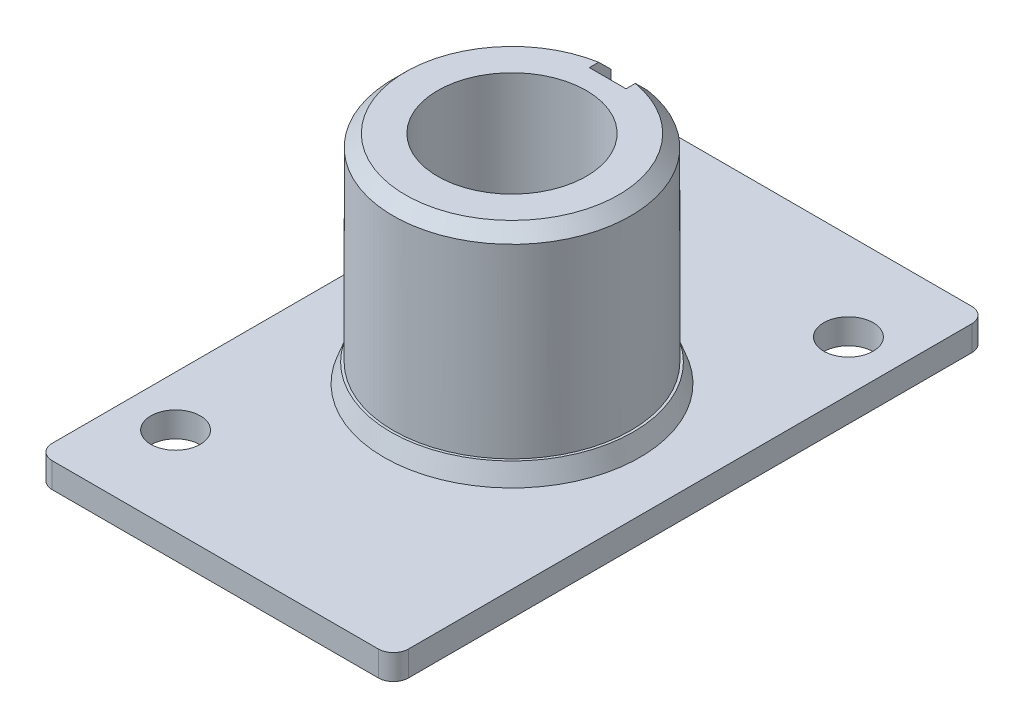
ISO-10303-21;
HEADER;
FILE_DESCRIPTION(('STEP AP214'),'2;1');
FILE_NAME('part.step','',(''),(''),'','','');
FILE_SCHEMA(('AUTOMOTIVE_DESIGN { 1 0 10303 214 1 1 1 1 }'));
ENDSEC;
DATA;
#1=APPLICATION_CONTEXT('core data for automotive mechanical design processes');
#2=APPLICATION_PROTOCOL_DEFINITION('international standard','automotive_design',2000,#1);
#3=PRODUCT_CONTEXT('',#1,'mechanical');
#4=PRODUCT('Part','Part','',(#3));
#5=PRODUCT_RELATED_PRODUCT_CATEGORY('part','',(#4));
#6=PRODUCT_DEFINITION_FORMATION('','',#4);
#7=PRODUCT_DEFINITION_CONTEXT('part definition',#1,'design');
#8=PRODUCT_DEFINITION('design','',#6,#7);
#9=PRODUCT_DEFINITION_SHAPE('','',#8);
#10=(LENGTH_UNIT() NAMED_UNIT(*) SI_UNIT(.MILLI.,.METRE.));
#11=(NAMED_UNIT(*) PLANE_ANGLE_UNIT() SI_UNIT($,.RADIAN.));
#12=(NAMED_UNIT(*) SI_UNIT($,.STERADIAN.) SOLID_ANGLE_UNIT());
#13=UNCERTAINTY_MEASURE_WITH_UNIT(LENGTH_MEASURE(1.E-05),#10,'distance_accuracy_value','');
#14=(GEOMETRIC_REPRESENTATION_CONTEXT(3) GLOBAL_UNCERTAINTY_ASSIGNED_CONTEXT((#13)) GLOBAL_UNIT_ASSIGNED_CONTEXT((#10,
#11,#12)) REPRESENTATION_CONTEXT('',''));
#15=CARTESIAN_POINT('',(0.,0.,0.));
#16=DIRECTION('',(0.,0.,1.));
#17=DIRECTION('',(1.,0.,0.));
#18=AXIS2_PLACEMENT_3D('',#15,#16,#17);
#19=CARTESIAN_POINT('',(-9.0043,0.,14.9987));
#20=DIRECTION('',(0.,-1.,0.));
#21=DIRECTION('',(0.,0.,-1.));
#22=AXIS2_PLACEMENT_3D('',#19,#20,#21);
#23=PLANE('',#22);
#24=CARTESIAN_POINT('',(6.4643,0.,-10.541));
#25=DIRECTION('',(0.,-1.,0.));
#26=DIRECTION('',(0.,0.,-1.));
#27=AXIS2_PLACEMENT_3D('',#24,#25,#26);
#28=CIRCLE('',#27,1.25);
#29=CARTESIAN_POINT('',(6.4643,0.,-11.791));
#30=VERTEX_POINT('',#29);
#31=EDGE_CURVE('E316',#30,#30,#28,.T.);
#32=ORIENTED_EDGE('',*,*,#31,.F.);
#33=EDGE_LOOP('',(#32));
#34=FACE_BOUND('',#33,.T.);
#35=CARTESIAN_POINT('',(-6.4643,0.,10.541));
#36=DIRECTION('',(0.,-1.,0.));
#37=DIRECTION('',(0.,0.,-1.));
#38=AXIS2_PLACEMENT_3D('',#35,#36,#37);
#39=CIRCLE('',#38,1.25);
#40=CARTESIAN_POINT('',(-6.4643,0.,9.291));
#41=VERTEX_POINT('',#40);
#42=EDGE_CURVE('E306',#41,#41,#39,.T.);
#43=ORIENTED_EDGE('',*,*,#42,.F.);
#44=EDGE_LOOP('',(#43));
#45=FACE_BOUND('',#44,.T.);
#46=DIRECTION('',(1.,0.,0.));
#47=VECTOR('',#46,1.);
#48=CARTESIAN_POINT('',(0.,0.,14.9987));
#49=LINE('',#48,#47);
#50=CARTESIAN_POINT('',(-8.2423,0.,14.9987));
#51=VERTEX_POINT('',#50);
#52=CARTESIAN_POINT('',(8.2423,0.,14.9987));
#53=VERTEX_POINT('',#52);
#54=EDGE_CURVE('E105',#51,#53,#49,.T.);
#55=ORIENTED_EDGE('',*,*,#54,.F.);
#56=CARTESIAN_POINT('',(-8.2423,0.,14.2367));
#57=DIRECTION('',(0.,-1.,0.));
#58=DIRECTION('',(0.,0.,-1.));
#59=AXIS2_PLACEMENT_3D('',#56,#57,#58);
#60=CIRCLE('',#59,0.762000000000006);
#61=CARTESIAN_POINT('',(-9.0043,0.,14.2367));
#62=VERTEX_POINT('',#61);
#63=EDGE_CURVE('E20',#62,#51,#60,.F.);
#64=ORIENTED_EDGE('',*,*,#63,.F.);
#65=DIRECTION('',(0.,0.,1.));
#66=VECTOR('',#65,1.);
#67=CARTESIAN_POINT('',(-9.0043,0.,0.));
#68=LINE('',#67,#66);
#69=CARTESIAN_POINT('',(-9.0043,0.,-14.2367));
#70=VERTEX_POINT('',#69);
#71=EDGE_CURVE('E119',#70,#62,#68,.T.);
#72=ORIENTED_EDGE('',*,*,#71,.F.);
#73=CARTESIAN_POINT('',(-8.2423,0.,-14.2367));
#74=DIRECTION('',(0.,-1.,0.));
#75=DIRECTION('',(0.,0.,-1.));
#76=AXIS2_PLACEMENT_3D('',#73,#74,#75);
#77=CIRCLE('',#76,0.762000000000001);
#78=CARTESIAN_POINT('',(-8.2423,0.,-14.9987));
#79=VERTEX_POINT('',#78);
#80=EDGE_CURVE('E303',#79,#70,#77,.F.);
#81=ORIENTED_EDGE('',*,*,#80,.F.);
#82=DIRECTION('',(-1.,0.,0.));
#83=VECTOR('',#82,1.);
#84=CARTESIAN_POINT('',(0.,0.,-14.9987));
#85=LINE('',#84,#83);
#86=CARTESIAN_POINT('',(8.2423,0.,-14.9987));
#87=VERTEX_POINT('',#86);
#88=EDGE_CURVE('E130',#87,#79,#85,.T.);
#89=ORIENTED_EDGE('',*,*,#88,.F.);
#90=CARTESIAN_POINT('',(8.2423,0.,-14.2367));
#91=DIRECTION('',(0.,-1.,0.));
#92=DIRECTION('',(0.,0.,-1.));
#93=AXIS2_PLACEMENT_3D('',#90,#91,#92);
#94=CIRCLE('',#93,0.762000000000001);
#95=CARTESIAN_POINT('',(9.0043,0.,-14.2367));
#96=VERTEX_POINT('',#95);
#97=EDGE_CURVE('E321',#96,#87,#94,.F.);
#98=ORIENTED_EDGE('',*,*,#97,.F.);
#99=DIRECTION('',(0.,0.,-1.));
#100=VECTOR('',#99,1.);
#101=CARTESIAN_POINT('',(9.0043,0.,0.));
#102=LINE('',#101,#100);
#103=CARTESIAN_POINT('',(9.0043,0.,14.2367));
#104=VERTEX_POINT('',#103);
#105=EDGE_CURVE('E136',#104,#96,#102,.T.);
#106=ORIENTED_EDGE('',*,*,#105,.F.);
#107=CARTESIAN_POINT('',(8.24229999999999,0.,14.2367));
#108=DIRECTION('',(0.,-1.,0.));
#109=DIRECTION('',(0.,0.,-1.));
#110=AXIS2_PLACEMENT_3D('',#107,#108,#109);
#111=CIRCLE('',#110,0.761999999999999);
#112=EDGE_CURVE('E107',#53,#104,#111,.F.);
#113=ORIENTED_EDGE('',*,*,#112,.F.);
#114=EDGE_LOOP('',(#55,#64,#72,#81,#89,#98,#106,#113));
#115=FACE_BOUND('',#114,.T.);
#116=ADVANCED_FACE('F17',(#34,#45,#115),#23,.T.);
#117=CARTESIAN_POINT('',(-9.0043,0.,-14.2367));
#118=DIRECTION('',(-1.,0.,0.));
#119=DIRECTION('',(0.,0.,1.));
#120=AXIS2_PLACEMENT_3D('',#117,#118,#119);
#121=PLANE('',#120);
#122=DIRECTION('',(0.,0.,1.));
#123=VECTOR('',#122,1.);
#124=CARTESIAN_POINT('',(-9.0043,1.27,0.));
#125=LINE('',#124,#123);
#126=CARTESIAN_POINT('',(-9.0043,1.27,-14.2367));
#127=VERTEX_POINT('',#126);
#128=CARTESIAN_POINT('',(-9.0043,1.27,14.2367));
#129=VERTEX_POINT('',#128);
#130=EDGE_CURVE('E312',#127,#129,#125,.T.);
#131=ORIENTED_EDGE('',*,*,#130,.F.);
#132=DIRECTION('',(0.,1.,0.));
#133=VECTOR('',#132,1.);
#134=CARTESIAN_POINT('',(-9.0043,0.635,-14.2367));
#135=LINE('',#134,#133);
#136=EDGE_CURVE('E299',#70,#127,#135,.T.);
#137=ORIENTED_EDGE('',*,*,#136,.F.);
#138=ORIENTED_EDGE('',*,*,#71,.T.);
#139=DIRECTION('',(0.,-1.,0.));
#140=VECTOR('',#139,1.);
#141=CARTESIAN_POINT('',(-9.0043,0.635,14.2367));
#142=LINE('',#141,#140);
#143=EDGE_CURVE('E112',#129,#62,#142,.T.);
#144=ORIENTED_EDGE('',*,*,#143,.F.);
#145=EDGE_LOOP('',(#131,#137,#138,#144));
#146=FACE_BOUND('',#145,.T.);
#147=ADVANCED_FACE('F230',(#146),#121,.T.);
#148=CARTESIAN_POINT('',(-8.2423,0.,14.2367));
#149=DIRECTION('',(0.,-1.,0.));
#150=DIRECTION('',(0.,0.,-1.));
#151=AXIS2_PLACEMENT_3D('',#148,#149,#150);
#152=CYLINDRICAL_SURFACE('',#151,0.762000000000006);
#153=CARTESIAN_POINT('',(-8.2423,1.27,14.2367));
#154=DIRECTION('',(0.,-1.,0.));
#155=DIRECTION('',(0.,0.,-1.));
#156=AXIS2_PLACEMENT_3D('',#153,#154,#155);
#157=CIRCLE('',#156,0.762000000000006);
#158=CARTESIAN_POINT('',(-8.2423,1.27,14.9987));
#159=VERTEX_POINT('',#158);
#160=EDGE_CURVE('E315',#129,#159,#157,.F.);
#161=ORIENTED_EDGE('',*,*,#160,.F.);
#162=ORIENTED_EDGE('',*,*,#143,.T.);
#163=ORIENTED_EDGE('',*,*,#63,.T.);
#164=DIRECTION('',(0.,1.,0.));
#165=VECTOR('',#164,1.);
#166=CARTESIAN_POINT('',(-8.2423,0.,14.9987));
#167=LINE('',#166,#165);
#168=EDGE_CURVE('E111',#159,#51,#167,.F.);
#169=ORIENTED_EDGE('',*,*,#168,.F.);
#170=EDGE_LOOP('',(#161,#162,#163,#169));
#171=FACE_BOUND('',#170,.T.);
#172=ADVANCED_FACE('F117',(#171),#152,.T.);
#173=CARTESIAN_POINT('',(-8.2423,0.,14.9987));
#174=DIRECTION('',(0.,0.,1.));
#175=DIRECTION('',(1.,0.,0.));
#176=AXIS2_PLACEMENT_3D('',#173,#174,#175);
#177=PLANE('',#176);
#178=DIRECTION('',(1.,0.,0.));
#179=VECTOR('',#178,1.);
#180=CARTESIAN_POINT('',(-9.0043,1.27,14.9987));
#181=LINE('',#180,#179);
#182=CARTESIAN_POINT('',(8.2423,1.27,14.9987));
#183=VERTEX_POINT('',#182);
#184=EDGE_CURVE('E122',#159,#183,#181,.T.);
#185=ORIENTED_EDGE('',*,*,#184,.F.);
#186=ORIENTED_EDGE('',*,*,#168,.T.);
#187=ORIENTED_EDGE('',*,*,#54,.T.);
#188=DIRECTION('',(0.,-1.,0.));
#189=VECTOR('',#188,1.);
#190=CARTESIAN_POINT('',(8.2423,0.635,14.9987));
#191=LINE('',#190,#189);
#192=EDGE_CURVE('E125',#183,#53,#191,.T.);
#193=ORIENTED_EDGE('',*,*,#192,.F.);
#194=EDGE_LOOP('',(#185,#186,#187,#193));
#195=FACE_BOUND('',#194,.T.);
#196=ADVANCED_FACE('F120',(#195),#177,.T.);
#197=CARTESIAN_POINT('',(8.24229999999999,0.,14.2367));
#198=DIRECTION('',(0.,-1.,0.));
#199=DIRECTION('',(0.,0.,-1.));
#200=AXIS2_PLACEMENT_3D('',#197,#198,#199);
#201=CYLINDRICAL_SURFACE('',#200,0.761999999999999);
#202=CARTESIAN_POINT('',(8.24229999999999,1.27,14.2367));
#203=DIRECTION('',(0.,-1.,0.));
#204=DIRECTION('',(0.,0.,-1.));
#205=AXIS2_PLACEMENT_3D('',#202,#203,#204);
#206=CIRCLE('',#205,0.761999999999999);
#207=CARTESIAN_POINT('',(9.0043,1.27,14.2367));
#208=VERTEX_POINT('',#207);
#209=EDGE_CURVE('E325',#183,#208,#206,.F.);
#210=ORIENTED_EDGE('',*,*,#209,.F.);
#211=ORIENTED_EDGE('',*,*,#192,.T.);
#212=ORIENTED_EDGE('',*,*,#112,.T.);
#213=DIRECTION('',(0.,1.,0.));
#214=VECTOR('',#213,1.);
#215=CARTESIAN_POINT('',(9.0043,0.,14.2367));
#216=LINE('',#215,#214);
#217=EDGE_CURVE('E138',#208,#104,#216,.F.);
#218=ORIENTED_EDGE('',*,*,#217,.F.);
#219=EDGE_LOOP('',(#210,#211,#212,#218));
#220=FACE_BOUND('',#219,.T.);
#221=ADVANCED_FACE('F222',(#220),#201,.T.);
#222=CARTESIAN_POINT('',(9.0043,0.,14.2367));
#223=DIRECTION('',(1.,0.,0.));
#224=DIRECTION('',(0.,0.,-1.));
#225=AXIS2_PLACEMENT_3D('',#222,#223,#224);
#226=PLANE('',#225);
#227=DIRECTION('',(0.,0.,-1.));
#228=VECTOR('',#227,1.);
#229=CARTESIAN_POINT('',(9.0043,1.27,0.));
#230=LINE('',#229,#228);
#231=CARTESIAN_POINT('',(9.0043,1.27,-14.2367));
#232=VERTEX_POINT('',#231);
#233=EDGE_CURVE('E322',#208,#232,#230,.T.);
#234=ORIENTED_EDGE('',*,*,#233,.F.);
#235=ORIENTED_EDGE('',*,*,#217,.T.);
#236=ORIENTED_EDGE('',*,*,#105,.T.);
#237=DIRECTION('',(0.,-1.,0.));
#238=VECTOR('',#237,1.);
#239=CARTESIAN_POINT('',(9.0043,0.635,-14.2367));
#240=LINE('',#239,#238);
#241=EDGE_CURVE('E134',#232,#96,#240,.T.);
#242=ORIENTED_EDGE('',*,*,#241,.F.);
#243=EDGE_LOOP('',(#234,#235,#236,#242));
#244=FACE_BOUND('',#243,.T.);
#245=ADVANCED_FACE('F218',(#244),#226,.T.);
#246=CARTESIAN_POINT('',(8.2423,0.,-14.2367));
#247=DIRECTION('',(0.,-1.,0.));
#248=DIRECTION('',(0.,0.,-1.));
#249=AXIS2_PLACEMENT_3D('',#246,#247,#248);
#250=CYLINDRICAL_SURFACE('',#249,0.762000000000001);
#251=CARTESIAN_POINT('',(8.2423,1.27,-14.2367));
#252=DIRECTION('',(0.,-1.,0.));
#253=DIRECTION('',(0.,0.,-1.));
#254=AXIS2_PLACEMENT_3D('',#251,#252,#253);
#255=CIRCLE('',#254,0.762000000000001);
#256=CARTESIAN_POINT('',(8.2423,1.27,-14.9987));
#257=VERTEX_POINT('',#256);
#258=EDGE_CURVE('E311',#232,#257,#255,.F.);
#259=ORIENTED_EDGE('',*,*,#258,.F.);
#260=ORIENTED_EDGE('',*,*,#241,.T.);
#261=ORIENTED_EDGE('',*,*,#97,.T.);
#262=DIRECTION('',(0.,1.,0.));
#263=VECTOR('',#262,1.);
#264=CARTESIAN_POINT('',(8.2423,0.,-14.9987));
#265=LINE('',#264,#263);
#266=EDGE_CURVE('E133',#257,#87,#265,.F.);
#267=ORIENTED_EDGE('',*,*,#266,.F.);
#268=EDGE_LOOP('',(#259,#260,#261,#267));
#269=FACE_BOUND('',#268,.T.);
#270=ADVANCED_FACE('F214',(#269),#250,.T.);
#271=CARTESIAN_POINT('',(8.2423,0.,-14.9987));
#272=DIRECTION('',(0.,0.,-1.));
#273=DIRECTION('',(-1.,0.,0.));
#274=AXIS2_PLACEMENT_3D('',#271,#272,#273);
#275=PLANE('',#274);
#276=DIRECTION('',(1.,0.,0.));
#277=VECTOR('',#276,1.);
#278=CARTESIAN_POINT('',(-9.0043,1.27,-14.9987));
#279=LINE('',#278,#277);
#280=CARTESIAN_POINT('',(-8.2423,1.27,-14.9987));
#281=VERTEX_POINT('',#280);
#282=EDGE_CURVE('E307',#257,#281,#279,.F.);
#283=ORIENTED_EDGE('',*,*,#282,.F.);
#284=ORIENTED_EDGE('',*,*,#266,.T.);
#285=ORIENTED_EDGE('',*,*,#88,.T.);
#286=DIRECTION('',(0.,-1.,0.));
#287=VECTOR('',#286,1.);
#288=CARTESIAN_POINT('',(-8.2423,0.635,-14.9987));
#289=LINE('',#288,#287);
#290=EDGE_CURVE('E302',#281,#79,#289,.T.);
#291=ORIENTED_EDGE('',*,*,#290,.F.);
#292=EDGE_LOOP('',(#283,#284,#285,#291));
#293=FACE_BOUND('',#292,.T.);
#294=ADVANCED_FACE('F210',(#293),#275,.T.);
#295=CARTESIAN_POINT('',(-8.2423,0.,-14.2367));
#296=DIRECTION('',(0.,-1.,0.));
#297=DIRECTION('',(0.,0.,-1.));
#298=AXIS2_PLACEMENT_3D('',#295,#296,#297);
#299=CYLINDRICAL_SURFACE('',#298,0.762000000000001);
#300=CARTESIAN_POINT('',(-8.2423,1.27,-14.2367));
#301=DIRECTION('',(0.,-1.,0.));
#302=DIRECTION('',(0.,0.,-1.));
#303=AXIS2_PLACEMENT_3D('',#300,#301,#302);
#304=CIRCLE('',#303,0.762000000000001);
#305=EDGE_CURVE('E310',#281,#127,#304,.F.);
#306=ORIENTED_EDGE('',*,*,#305,.F.);
#307=ORIENTED_EDGE('',*,*,#290,.T.);
#308=ORIENTED_EDGE('',*,*,#80,.T.);
#309=ORIENTED_EDGE('',*,*,#136,.T.);
#310=EDGE_LOOP('',(#306,#307,#308,#309));
#311=FACE_BOUND('',#310,.T.);
#312=ADVANCED_FACE('F206',(#311),#299,.T.);
#313=CARTESIAN_POINT('',(-6.4643,1.27,10.541));
#314=DIRECTION('',(0.,-1.,0.));
#315=DIRECTION('',(0.,0.,-1.));
#316=AXIS2_PLACEMENT_3D('',#313,#314,#315);
#317=CYLINDRICAL_SURFACE('',#316,1.25);
#318=ORIENTED_EDGE('',*,*,#42,.T.);
#319=EDGE_LOOP('',(#318));
#320=FACE_BOUND('',#319,.T.);
#321=CARTESIAN_POINT('',(-6.4643,1.27,10.541));
#322=DIRECTION('',(0.,-1.,0.));
#323=DIRECTION('',(0.,0.,-1.));
#324=AXIS2_PLACEMENT_3D('',#321,#322,#323);
#325=CIRCLE('',#324,1.25);
#326=CARTESIAN_POINT('',(-6.4643,1.27,9.291));
#327=VERTEX_POINT('',#326);
#328=EDGE_CURVE('E349',#327,#327,#325,.T.);
#329=ORIENTED_EDGE('',*,*,#328,.F.);
#330=EDGE_LOOP('',(#329));
#331=FACE_BOUND('',#330,.T.);
#332=ADVANCED_FACE('F202',(#320,#331),#317,.F.);
#333=CARTESIAN_POINT('',(6.4643,1.27,-10.541));
#334=DIRECTION('',(0.,-1.,0.));
#335=DIRECTION('',(0.,0.,-1.));
#336=AXIS2_PLACEMENT_3D('',#333,#334,#335);
#337=CYLINDRICAL_SURFACE('',#336,1.25);
#338=ORIENTED_EDGE('',*,*,#31,.T.);
#339=EDGE_LOOP('',(#338));
#340=FACE_BOUND('',#339,.T.);
#341=CARTESIAN_POINT('',(6.4643,1.27,-10.541));
#342=DIRECTION('',(0.,-1.,0.));
#343=DIRECTION('',(0.,0.,-1.));
#344=AXIS2_PLACEMENT_3D('',#341,#342,#343);
#345=CIRCLE('',#344,1.25);
#346=CARTESIAN_POINT('',(6.4643,1.27,-11.791));
#347=VERTEX_POINT('',#346);
#348=EDGE_CURVE('E296',#347,#347,#345,.T.);
#349=ORIENTED_EDGE('',*,*,#348,.F.);
#350=EDGE_LOOP('',(#349));
#351=FACE_BOUND('',#350,.T.);
#352=ADVANCED_FACE('F198',(#340,#351),#337,.F.);
#353=CARTESIAN_POINT('',(-3.80431040000001,1.27,-3.8043104));
#354=DIRECTION('',(0.,1.,0.));
#355=DIRECTION('',(0.,0.,1.));
#356=AXIS2_PLACEMENT_3D('',#353,#354,#355);
#357=PLANE('',#356);
#358=CARTESIAN_POINT('',(0.,1.27,0.));
#359=DIRECTION('',(0.,-1.,0.));
#360=DIRECTION('',(0.,0.,-1.));
#361=AXIS2_PLACEMENT_3D('',#358,#359,#360);
#362=CIRCLE('',#361,3.7592);
#363=CARTESIAN_POINT('',(0.,1.27,-3.7592));
#364=VERTEX_POINT('',#363);
#365=EDGE_CURVE('E355',#364,#364,#362,.T.);
#366=ORIENTED_EDGE('',*,*,#365,.F.);
#367=EDGE_LOOP('',(#366));
#368=FACE_BOUND('',#367,.T.);
#369=ADVANCED_FACE('F194',(#368),#357,.T.);
#370=CARTESIAN_POINT('',(-9.0043,1.27,-14.9987));
#371=DIRECTION('',(0.,1.,0.));
#372=DIRECTION('',(0.,0.,1.));
#373=AXIS2_PLACEMENT_3D('',#370,#371,#372);
#374=PLANE('',#373);
#375=CARTESIAN_POINT('',(0.,1.27,0.));
#376=DIRECTION('',(0.,-1.,0.));
#377=DIRECTION('',(0.,0.,-1.));
#378=AXIS2_PLACEMENT_3D('',#375,#376,#377);
#379=CIRCLE('',#378,6.46905922616338);
#380=CARTESIAN_POINT('',(0.,1.27,-6.46905922616338));
#381=VERTEX_POINT('',#380);
#382=EDGE_CURVE('E282',#381,#381,#379,.F.);
#383=ORIENTED_EDGE('',*,*,#382,.F.);
#384=EDGE_LOOP('',(#383));
#385=FACE_BOUND('',#384,.T.);
#386=ORIENTED_EDGE('',*,*,#348,.T.);
#387=EDGE_LOOP('',(#386));
#388=FACE_BOUND('',#387,.T.);
#389=ORIENTED_EDGE('',*,*,#328,.T.);
#390=EDGE_LOOP('',(#389));
#391=FACE_BOUND('',#390,.T.);
#392=ORIENTED_EDGE('',*,*,#282,.T.);
#393=ORIENTED_EDGE('',*,*,#305,.T.);
#394=ORIENTED_EDGE('',*,*,#130,.T.);
#395=ORIENTED_EDGE('',*,*,#160,.T.);
#396=ORIENTED_EDGE('',*,*,#184,.T.);
#397=ORIENTED_EDGE('',*,*,#209,.T.);
#398=ORIENTED_EDGE('',*,*,#233,.T.);
#399=ORIENTED_EDGE('',*,*,#258,.T.);
#400=EDGE_LOOP('',(#392,#393,#394,#395,#396,#397,#398,#399));
#401=FACE_BOUND('',#400,.T.);
#402=ADVANCED_FACE('F190',(#385,#388,#391,#401),#374,.T.);
#403=CARTESIAN_POINT('',(-0.9271,3.4798,-6.00698555344811));
#404=DIRECTION('',(0.,1.,0.));
#405=DIRECTION('',(0.,0.,1.));
#406=AXIS2_PLACEMENT_3D('',#403,#404,#405);
#407=PLANE('',#406);
#408=DIRECTION('',(0.,0.,-1.));
#409=VECTOR('',#408,1.);
#410=CARTESIAN_POINT('',(0.9271,3.4798,-5.42136332271468));
#411=LINE('',#410,#409);
#412=CARTESIAN_POINT('',(0.9271,3.4798,-4.83574109198126));
#413=VERTEX_POINT('',#412);
#414=CARTESIAN_POINT('',(0.927099999999994,3.47979999999998,-5.92794109198126));
#415=VERTEX_POINT('',#414);
#416=EDGE_CURVE('E289',#413,#415,#411,.T.);
#417=ORIENTED_EDGE('',*,*,#416,.T.);
#418=CARTESIAN_POINT('',(0.,3.47979999999998,0.));
#419=DIRECTION('',(0.,-1.,0.));
#420=DIRECTION('',(0.,0.,-1.));
#421=AXIS2_PLACEMENT_3D('',#418,#419,#420);
#422=CIRCLE('',#421,6.);
#423=CARTESIAN_POINT('',(-0.927100000000003,3.47979999999999,-5.92794109198126));
#424=VERTEX_POINT('',#423);
#425=EDGE_CURVE('E250',#415,#424,#422,.F.);
#426=ORIENTED_EDGE('',*,*,#425,.T.);
#427=DIRECTION('',(0.,0.,1.));
#428=VECTOR('',#427,1.);
#429=CARTESIAN_POINT('',(-0.9271,3.4798,-5.42136332271468));
#430=LINE('',#429,#428);
#431=CARTESIAN_POINT('',(-0.9271,3.4798,-4.83574109198126));
#432=VERTEX_POINT('',#431);
#433=EDGE_CURVE('E291',#424,#432,#430,.T.);
#434=ORIENTED_EDGE('',*,*,#433,.T.);
#435=DIRECTION('',(-1.,0.,0.));
#436=VECTOR('',#435,1.);
#437=CARTESIAN_POINT('',(0.,3.4798,-4.83574109198126));
#438=LINE('',#437,#436);
#439=EDGE_CURVE('E272',#413,#432,#438,.T.);
#440=ORIENTED_EDGE('',*,*,#439,.F.);
#441=EDGE_LOOP('',(#417,#426,#434,#440));
#442=FACE_BOUND('',#441,.T.);
#443=ADVANCED_FACE('F186',(#442),#407,.T.);
#444=CARTESIAN_POINT('',(0.,12.2174,0.));
#445=DIRECTION('',(0.,-1.,0.));
#446=DIRECTION('',(0.,0.,-1.));
#447=AXIS2_PLACEMENT_3D('',#444,#445,#446);
#448=CYLINDRICAL_SURFACE('',#447,3.7592);
#449=ORIENTED_EDGE('',*,*,#365,.T.);
#450=EDGE_LOOP('',(#449));
#451=FACE_BOUND('',#450,.T.);
#452=CARTESIAN_POINT('',(0.,12.2174,0.));
#453=DIRECTION('',(0.,-1.,0.));
#454=DIRECTION('',(0.,0.,-1.));
#455=AXIS2_PLACEMENT_3D('',#452,#453,#454);
#456=CIRCLE('',#455,3.7592);
#457=CARTESIAN_POINT('',(0.,12.2174,-3.7592));
#458=VERTEX_POINT('',#457);
#459=EDGE_CURVE('E265',#458,#458,#456,.T.);
#460=ORIENTED_EDGE('',*,*,#459,.F.);
#461=EDGE_LOOP('',(#460));
#462=FACE_BOUND('',#461,.T.);
#463=ADVANCED_FACE('F182',(#451,#462),#448,.F.);
#464=CARTESIAN_POINT('',(0.,2.2098,0.));
#465=DIRECTION('',(0.,-1.,0.));
#466=DIRECTION('',(0.,0.,-1.));
#467=AXIS2_PLACEMENT_3D('',#464,#465,#466);
#468=CONICAL_SURFACE('',#467,6.127,0.349065850398871);
#469=ORIENTED_EDGE('',*,*,#382,.T.);
#470=EDGE_LOOP('',(#469));
#471=FACE_BOUND('',#470,.T.);
#472=CARTESIAN_POINT('',(0.,2.2098,0.));
#473=DIRECTION('',(0.,-1.,0.));
#474=DIRECTION('',(0.,0.,-1.));
#475=AXIS2_PLACEMENT_3D('',#472,#473,#474);
#476=CIRCLE('',#475,6.127);
#477=CARTESIAN_POINT('',(0.,2.2098,-6.127));
#478=VERTEX_POINT('',#477);
#479=EDGE_CURVE('E277',#478,#478,#476,.F.);
#480=ORIENTED_EDGE('',*,*,#479,.F.);
#481=EDGE_LOOP('',(#480));
#482=FACE_BOUND('',#481,.T.);
#483=ADVANCED_FACE('F178',(#471,#482),#468,.T.);
#484=CARTESIAN_POINT('',(0.9271,3.4798,-4.83574109198126));
#485=DIRECTION('',(0.,0.,-1.));
#486=DIRECTION('',(-1.,0.,0.));
#487=AXIS2_PLACEMENT_3D('',#484,#485,#486);
#488=PLANE('',#487);
#489=DIRECTION('',(0.,1.,0.));
#490=VECTOR('',#489,1.);
#491=CARTESIAN_POINT('',(-0.9271,3.4798,-4.83574109198126));
#492=LINE('',#491,#490);
#493=CARTESIAN_POINT('',(-0.927099999999988,12.2174,-4.83574109198126));
#494=VERTEX_POINT('',#493);
#495=EDGE_CURVE('E264',#494,#432,#492,.F.);
#496=ORIENTED_EDGE('',*,*,#495,.F.);
#497=DIRECTION('',(1.,0.,0.));
#498=VECTOR('',#497,1.);
#499=CARTESIAN_POINT('',(-5.451138,12.2174,-4.83574109198127));
#500=LINE('',#499,#498);
#501=CARTESIAN_POINT('',(0.9271,12.2174,-4.83574109198126));
#502=VERTEX_POINT('',#501);
#503=EDGE_CURVE('E269',#502,#494,#500,.F.);
#504=ORIENTED_EDGE('',*,*,#503,.F.);
#505=DIRECTION('',(0.,1.,0.));
#506=VECTOR('',#505,1.);
#507=CARTESIAN_POINT('',(0.9271,3.4798,-4.83574109198126));
#508=LINE('',#507,#506);
#509=EDGE_CURVE('E258',#413,#502,#508,.T.);
#510=ORIENTED_EDGE('',*,*,#509,.F.);
#511=ORIENTED_EDGE('',*,*,#439,.T.);
#512=EDGE_LOOP('',(#496,#504,#510,#511));
#513=FACE_BOUND('',#512,.T.);
#514=ADVANCED_FACE('F174',(#513),#488,.T.);
#515=CARTESIAN_POINT('',(-5.45266691048353,12.2174,-5.37027177511166));
#516=DIRECTION('',(0.,1.,0.));
#517=DIRECTION('',(0.,0.,1.));
#518=AXIS2_PLACEMENT_3D('',#515,#516,#517);
#519=PLANE('',#518);
#520=ORIENTED_EDGE('',*,*,#459,.T.);
#521=EDGE_LOOP('',(#520));
#522=FACE_BOUND('',#521,.T.);
#523=CARTESIAN_POINT('',(0.,12.2174,0.));
#524=DIRECTION('',(0.,-1.,0.));
#525=DIRECTION('',(0.,0.,-1.));
#526=AXIS2_PLACEMENT_3D('',#523,#524,#525);
#527=CIRCLE('',#526,5.3865);
#528=CARTESIAN_POINT('',(0.9271,12.2174,-5.30611607863982));
#529=VERTEX_POINT('',#528);
#530=CARTESIAN_POINT('',(-0.9271,12.2174,-5.30611607863982));
#531=VERTEX_POINT('',#530);
#532=EDGE_CURVE('E257',#529,#531,#527,.T.);
#533=ORIENTED_EDGE('',*,*,#532,.F.);
#534=DIRECTION('',(0.,0.,-1.));
#535=VECTOR('',#534,1.);
#536=CARTESIAN_POINT('',(0.9271,12.2174,-5.38184109198126));
#537=LINE('',#536,#535);
#538=EDGE_CURVE('E255',#502,#529,#537,.T.);
#539=ORIENTED_EDGE('',*,*,#538,.F.);
#540=ORIENTED_EDGE('',*,*,#503,.T.);
#541=DIRECTION('',(0.,0.,1.));
#542=VECTOR('',#541,1.);
#543=CARTESIAN_POINT('',(-0.9271,12.2174,-5.38184109198126));
#544=LINE('',#543,#542);
#545=EDGE_CURVE('E261',#531,#494,#544,.T.);
#546=ORIENTED_EDGE('',*,*,#545,.F.);
#547=EDGE_LOOP('',(#533,#539,#540,#546));
#548=FACE_BOUND('',#547,.T.);
#549=ADVANCED_FACE('F170',(#522,#548),#519,.T.);
#550=CARTESIAN_POINT('',(-0.9271,3.4798,-4.83574109198126));
#551=DIRECTION('',(1.,0.,0.));
#552=DIRECTION('',(0.,0.,-1.));
#553=AXIS2_PLACEMENT_3D('',#550,#551,#552);
#554=PLANE('',#553);
#555=ORIENTED_EDGE('',*,*,#433,.F.);
#556=DIRECTION('',(0.,-1.,0.));
#557=VECTOR('',#556,1.);
#558=CARTESIAN_POINT('',(-0.927100000000014,6.90685,-5.92794109198126));
#559=LINE('',#558,#557);
#560=CARTESIAN_POINT('',(-0.927100000000007,11.6039,-5.92794109198126));
#561=VERTEX_POINT('',#560);
#562=EDGE_CURVE('E143',#561,#424,#559,.T.);
#563=ORIENTED_EDGE('',*,*,#562,.F.);
#564=CARTESIAN_POINT('',(-0.9271,12.2174,-5.30611607863982));
#565=CARTESIAN_POINT('',(-0.9271,12.1152262789525,-5.4098288400833));
#566=CARTESIAN_POINT('',(-0.9271,12.0130144180555,-5.51350397229469));
#567=CARTESIAN_POINT('',(-0.9271,11.8085144180543,-5.72077897674074));
#568=CARTESIAN_POINT('',(-0.9271,11.7062262789514,-5.8243788489765));
#569=CARTESIAN_POINT('',(-0.9271,11.6039,-5.92794109198126));
#570=B_SPLINE_CURVE_WITH_KNOTS('',3,(#564,#565,#566,#567,#568,#569),.UNSPECIFIED.,.F.,.F.,(4,2,
4),(0.,0.436763297363521,0.873526588352607),.UNSPECIFIED.);
#571=EDGE_CURVE('E150',#531,#561,#570,.T.);
#572=ORIENTED_EDGE('',*,*,#571,.F.);
#573=ORIENTED_EDGE('',*,*,#545,.T.);
#574=ORIENTED_EDGE('',*,*,#495,.T.);
#575=EDGE_LOOP('',(#555,#563,#572,#573,#574));
#576=FACE_BOUND('',#575,.T.);
#577=ADVANCED_FACE('F165',(#576),#554,.T.);
#578=CARTESIAN_POINT('',(-6.20052400000001,2.2098,-6.200524));
#579=DIRECTION('',(0.,1.,0.));
#580=DIRECTION('',(0.,0.,1.));
#581=AXIS2_PLACEMENT_3D('',#578,#579,#580);
#582=PLANE('',#581);
#583=CARTESIAN_POINT('',(0.,2.2098,0.));
#584=DIRECTION('',(0.,-1.,0.));
#585=DIRECTION('',(0.,0.,-1.));
#586=AXIS2_PLACEMENT_3D('',#583,#584,#585);
#587=CIRCLE('',#586,6.);
#588=CARTESIAN_POINT('',(0.,2.2098,-6.));
#589=VERTEX_POINT('',#588);
#590=EDGE_CURVE('E140',#589,#589,#587,.F.);
#591=ORIENTED_EDGE('',*,*,#590,.F.);
#592=EDGE_LOOP('',(#591));
#593=FACE_BOUND('',#592,.T.);
#594=ORIENTED_EDGE('',*,*,#479,.T.);
#595=EDGE_LOOP('',(#594));
#596=FACE_BOUND('',#595,.T.);
#597=ADVANCED_FACE('F163',(#593,#596),#582,.T.);
#598=CARTESIAN_POINT('',(0.9271,3.4798,-5.92794109198126));
#599=DIRECTION('',(-1.,0.,0.));
#600=DIRECTION('',(0.,0.,1.));
#601=AXIS2_PLACEMENT_3D('',#598,#599,#600);
#602=PLANE('',#601);
#603=CARTESIAN_POINT('',(0.9271,11.6039,-5.92794109198126));
#604=CARTESIAN_POINT('',(0.9271,11.7062262789514,-5.8243788489765));
#605=CARTESIAN_POINT('',(0.9271,11.8085144180543,-5.72077897674074));
#606=CARTESIAN_POINT('',(0.9271,12.0130144180555,-5.51350397229469));
#607=CARTESIAN_POINT('',(0.9271,12.1152262789525,-5.4098288400833));
#608=CARTESIAN_POINT('',(0.9271,12.2174,-5.30611607863982));
#609=B_SPLINE_CURVE_WITH_KNOTS('',3,(#603,#604,#605,#606,#607,#608),.UNSPECIFIED.,.F.,.F.,(4,2,
4),(0.,0.436763290989085,0.873526588352605),.UNSPECIFIED.);
#610=CARTESIAN_POINT('',(0.927099999999989,11.6039,-5.92794109198126));
#611=VERTEX_POINT('',#610);
#612=EDGE_CURVE('E35',#611,#529,#609,.T.);
#613=ORIENTED_EDGE('',*,*,#612,.F.);
#614=DIRECTION('',(0.,1.,0.));
#615=VECTOR('',#614,1.);
#616=CARTESIAN_POINT('',(0.927099999999978,6.90685,-5.92794109198127));
#617=LINE('',#616,#615);
#618=EDGE_CURVE('E26',#415,#611,#617,.T.);
#619=ORIENTED_EDGE('',*,*,#618,.F.);
#620=ORIENTED_EDGE('',*,*,#416,.F.);
#621=ORIENTED_EDGE('',*,*,#509,.T.);
#622=ORIENTED_EDGE('',*,*,#538,.T.);
#623=EDGE_LOOP('',(#613,#619,#620,#621,#622));
#624=FACE_BOUND('',#623,.T.);
#625=ADVANCED_FACE('F159',(#624),#602,.T.);
#626=CARTESIAN_POINT('',(0.,12.2174,0.));
#627=DIRECTION('',(0.,-1.,0.));
#628=DIRECTION('',(0.,0.,-1.));
#629=AXIS2_PLACEMENT_3D('',#626,#627,#628);
#630=CONICAL_SURFACE('',#629,5.3865,0.785398163397449);
#631=CARTESIAN_POINT('',(0.,11.6039,0.));
#632=DIRECTION('',(0.,-1.,0.));
#633=DIRECTION('',(0.,0.,-1.));
#634=AXIS2_PLACEMENT_3D('',#631,#632,#633);
#635=CIRCLE('',#634,6.);
#636=EDGE_CURVE('E11',#611,#561,#635,.T.);
#637=ORIENTED_EDGE('',*,*,#636,.F.);
#638=ORIENTED_EDGE('',*,*,#612,.T.);
#639=ORIENTED_EDGE('',*,*,#532,.T.);
#640=ORIENTED_EDGE('',*,*,#571,.T.);
#641=EDGE_LOOP('',(#637,#638,#639,#640));
#642=FACE_BOUND('',#641,.T.);
#643=ADVANCED_FACE('F156',(#642),#630,.T.);
#644=CARTESIAN_POINT('',(0.,2.2098,0.));
#645=DIRECTION('',(0.,-1.,0.));
#646=DIRECTION('',(0.,0.,-1.));
#647=AXIS2_PLACEMENT_3D('',#644,#645,#646);
#648=CYLINDRICAL_SURFACE('',#647,6.);
#649=ORIENTED_EDGE('',*,*,#590,.T.);
#650=EDGE_LOOP('',(#649));
#651=FACE_BOUND('',#650,.T.);
#652=ORIENTED_EDGE('',*,*,#618,.T.);
#653=ORIENTED_EDGE('',*,*,#636,.T.);
#654=ORIENTED_EDGE('',*,*,#562,.T.);
#655=ORIENTED_EDGE('',*,*,#425,.F.);
#656=EDGE_LOOP('',(#652,#653,#654,#655));
#657=FACE_BOUND('',#656,.T.);
#658=ADVANCED_FACE('F238',(#651,#657),#648,.T.);
#659=CLOSED_SHELL('',(#116,#147,#172,#196,#221,#245,#270,#294,#312,#332,#352,#369,#402,#443,
#463,#483,#514,#549,#577,#597,#625,#643,#658));
#660=MANIFOLD_SOLID_BREP('B1',#659);
#661=ADVANCED_BREP_SHAPE_REPRESENTATION('',(#18,#660),#14);
#662=SHAPE_DEFINITION_REPRESENTATION(#9,#661);
ENDSEC;
END-ISO-10303-21;
